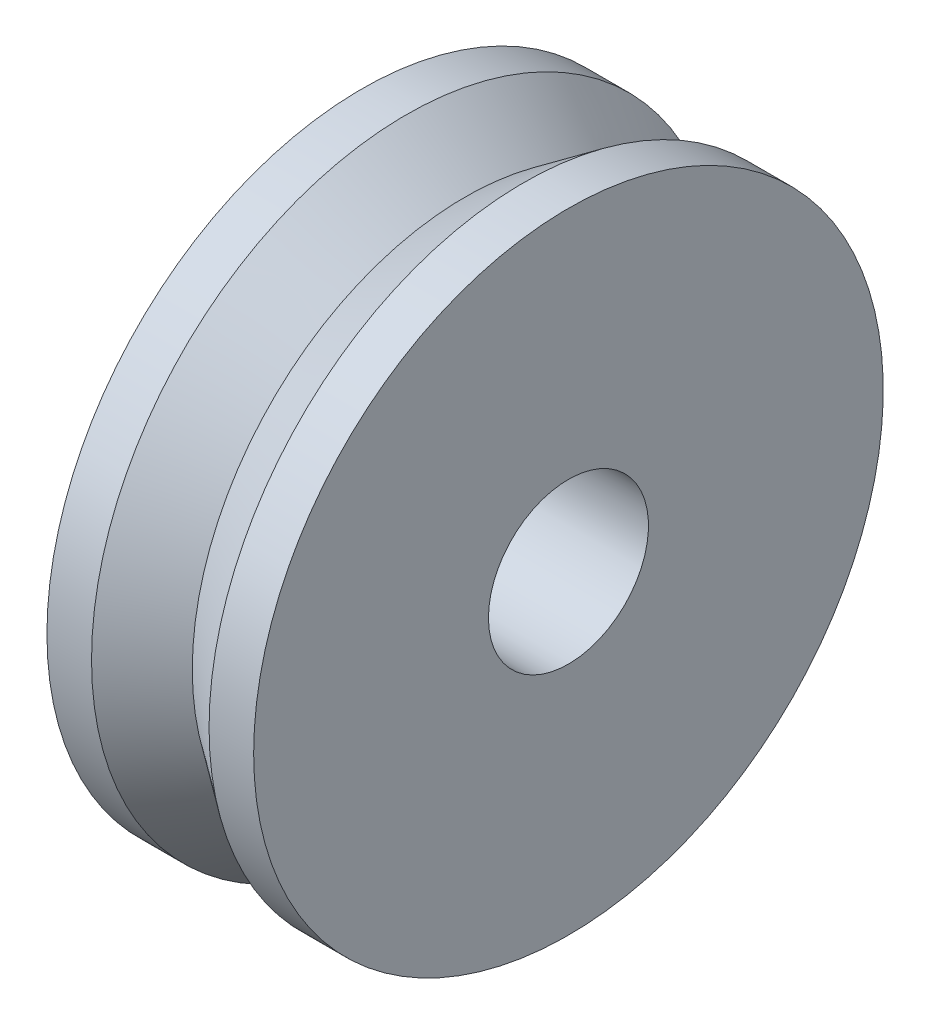
ISO-10303-21;
HEADER;
FILE_DESCRIPTION(('STEP AP214'),'2;1');
FILE_NAME('part.step','',(''),(''),'','','');
FILE_SCHEMA(('AUTOMOTIVE_DESIGN { 1 0 10303 214 1 1 1 1 }'));
ENDSEC;
DATA;
#1=APPLICATION_CONTEXT('core data for automotive mechanical design processes');
#2=APPLICATION_PROTOCOL_DEFINITION('international standard','automotive_design',2000,#1);
#3=PRODUCT_CONTEXT('',#1,'mechanical');
#4=PRODUCT('Part','Part','',(#3));
#5=PRODUCT_RELATED_PRODUCT_CATEGORY('part','',(#4));
#6=PRODUCT_DEFINITION_FORMATION('','',#4);
#7=PRODUCT_DEFINITION_CONTEXT('part definition',#1,'design');
#8=PRODUCT_DEFINITION('design','',#6,#7);
#9=PRODUCT_DEFINITION_SHAPE('','',#8);
#10=(LENGTH_UNIT() NAMED_UNIT(*) SI_UNIT(.MILLI.,.METRE.));
#11=(NAMED_UNIT(*) PLANE_ANGLE_UNIT() SI_UNIT($,.RADIAN.));
#12=(NAMED_UNIT(*) SI_UNIT($,.STERADIAN.) SOLID_ANGLE_UNIT());
#13=UNCERTAINTY_MEASURE_WITH_UNIT(LENGTH_MEASURE(1.E-05),#10,'distance_accuracy_value','');
#14=(GEOMETRIC_REPRESENTATION_CONTEXT(3) GLOBAL_UNCERTAINTY_ASSIGNED_CONTEXT((#13)) GLOBAL_UNIT_ASSIGNED_CONTEXT((#10,
#11,#12)) REPRESENTATION_CONTEXT('',''));
#15=CARTESIAN_POINT('',(0.,0.,0.));
#16=DIRECTION('',(0.,0.,1.));
#17=DIRECTION('',(1.,0.,0.));
#18=AXIS2_PLACEMENT_3D('',#15,#16,#17);
#19=CARTESIAN_POINT('',(-1.68761800987324,2.86482394366197,0.));
#20=DIRECTION('',(1.,0.,0.));
#21=DIRECTION('',(0.,0.,-1.));
#22=AXIS2_PLACEMENT_3D('',#19,#20,#21);
#23=PLANE('',#22);
#24=CARTESIAN_POINT('',(-1.68761800987324,-3.13517605633803,0.));
#25=DIRECTION('',(-1.,0.,0.));
#26=DIRECTION('',(0.,0.,1.));
#27=AXIS2_PLACEMENT_3D('',#24,#25,#26);
#28=CIRCLE('',#27,1.525);
#29=CARTESIAN_POINT('',(-1.68761800987324,-3.13517605633803,1.525));
#30=VERTEX_POINT('',#29);
#31=EDGE_CURVE('E54',#30,#30,#28,.T.);
#32=ORIENTED_EDGE('',*,*,#31,.F.);
#33=EDGE_LOOP('',(#32));
#34=FACE_BOUND('',#33,.T.);
#35=CARTESIAN_POINT('',(-1.68761800987324,-3.13517605633803,0.));
#36=DIRECTION('',(-1.,0.,0.));
#37=DIRECTION('',(0.,0.,1.));
#38=AXIS2_PLACEMENT_3D('',#35,#36,#37);
#39=CIRCLE('',#38,6.);
#40=CARTESIAN_POINT('',(-1.68761800987324,-3.13517605633803,6.));
#41=VERTEX_POINT('',#40);
#42=EDGE_CURVE('E50',#41,#41,#39,.T.);
#43=ORIENTED_EDGE('',*,*,#42,.T.);
#44=EDGE_LOOP('',(#43));
#45=FACE_BOUND('',#44,.T.);
#46=ADVANCED_FACE('F31',(#34,#45),#23,.F.);
#47=CARTESIAN_POINT('',(2.25238199012676,-3.13517605633803,0.));
#48=DIRECTION('',(-1.,0.,0.));
#49=DIRECTION('',(0.,0.,1.));
#50=AXIS2_PLACEMENT_3D('',#47,#48,#49);
#51=PLANE('',#50);
#52=CARTESIAN_POINT('',(2.25238199012676,-3.13517605633803,0.));
#53=DIRECTION('',(-1.,0.,0.));
#54=DIRECTION('',(0.,0.,1.));
#55=AXIS2_PLACEMENT_3D('',#52,#53,#54);
#56=CIRCLE('',#55,1.525);
#57=CARTESIAN_POINT('',(2.25238199012676,-3.13517605633803,1.525));
#58=VERTEX_POINT('',#57);
#59=EDGE_CURVE('E53',#58,#58,#56,.T.);
#60=ORIENTED_EDGE('',*,*,#59,.T.);
#61=EDGE_LOOP('',(#60));
#62=FACE_BOUND('',#61,.T.);
#63=CARTESIAN_POINT('',(2.25238199012676,-3.13517605633803,0.));
#64=DIRECTION('',(-1.,0.,0.));
#65=DIRECTION('',(0.,0.,1.));
#66=AXIS2_PLACEMENT_3D('',#63,#64,#65);
#67=CIRCLE('',#66,6.);
#68=CARTESIAN_POINT('',(2.25238199012676,-3.13517605633803,6.));
#69=VERTEX_POINT('',#68);
#70=EDGE_CURVE('E10',#69,#69,#67,.T.);
#71=ORIENTED_EDGE('',*,*,#70,.F.);
#72=EDGE_LOOP('',(#71));
#73=FACE_BOUND('',#72,.T.);
#74=ADVANCED_FACE('F60',(#62,#73),#51,.F.);
#75=CARTESIAN_POINT('',(-1.68761800987324,-3.13517605633803,0.));
#76=DIRECTION('',(-1.,0.,0.));
#77=DIRECTION('',(0.,0.,1.));
#78=AXIS2_PLACEMENT_3D('',#75,#76,#77);
#79=CYLINDRICAL_SURFACE('',#78,6.);
#80=CARTESIAN_POINT('',(1.40238199012676,-3.13517605633803,0.));
#81=DIRECTION('',(-1.,0.,0.));
#82=DIRECTION('',(0.,0.,1.));
#83=AXIS2_PLACEMENT_3D('',#80,#81,#82);
#84=CIRCLE('',#83,6.);
#85=CARTESIAN_POINT('',(1.40238199012676,-3.13517605633803,6.));
#86=VERTEX_POINT('',#85);
#87=EDGE_CURVE('E37',#86,#86,#84,.T.);
#88=ORIENTED_EDGE('',*,*,#87,.F.);
#89=EDGE_LOOP('',(#88));
#90=FACE_BOUND('',#89,.T.);
#91=ORIENTED_EDGE('',*,*,#70,.T.);
#92=EDGE_LOOP('',(#91));
#93=FACE_BOUND('',#92,.T.);
#94=ADVANCED_FACE('F87',(#90,#93),#79,.T.);
#95=CARTESIAN_POINT('',(1.40238199012676,-3.13517605633803,0.));
#96=DIRECTION('',(1.,0.,0.));
#97=DIRECTION('',(0.,0.,-1.));
#98=AXIS2_PLACEMENT_3D('',#95,#96,#97);
#99=CONICAL_SURFACE('',#98,6.,0.620249485982822);
#100=CARTESIAN_POINT('',(0.282381990126762,-3.13517605633803,0.));
#101=DIRECTION('',(-1.,0.,0.));
#102=DIRECTION('',(0.,0.,1.));
#103=AXIS2_PLACEMENT_3D('',#100,#101,#102);
#104=CIRCLE('',#103,5.2);
#105=CARTESIAN_POINT('',(0.282381990126762,-3.13517605633803,5.2));
#106=VERTEX_POINT('',#105);
#107=EDGE_CURVE('E41',#106,#106,#104,.T.);
#108=ORIENTED_EDGE('',*,*,#107,.F.);
#109=EDGE_LOOP('',(#108));
#110=FACE_BOUND('',#109,.T.);
#111=ORIENTED_EDGE('',*,*,#87,.T.);
#112=EDGE_LOOP('',(#111));
#113=FACE_BOUND('',#112,.T.);
#114=ADVANCED_FACE('F82',(#110,#113),#99,.T.);
#115=CARTESIAN_POINT('',(0.282381990126762,-3.13517605633803,0.));
#116=DIRECTION('',(-1.,0.,0.));
#117=DIRECTION('',(0.,0.,1.));
#118=AXIS2_PLACEMENT_3D('',#115,#116,#117);
#119=CONICAL_SURFACE('',#118,5.2,0.620249485982822);
#120=CARTESIAN_POINT('',(-0.837618009873239,-3.13517605633803,0.));
#121=DIRECTION('',(-1.,0.,0.));
#122=DIRECTION('',(0.,0.,1.));
#123=AXIS2_PLACEMENT_3D('',#120,#121,#122);
#124=CIRCLE('',#123,6.);
#125=CARTESIAN_POINT('',(-0.837618009873239,-3.13517605633803,6.));
#126=VERTEX_POINT('',#125);
#127=EDGE_CURVE('E45',#126,#126,#124,.T.);
#128=ORIENTED_EDGE('',*,*,#127,.F.);
#129=EDGE_LOOP('',(#128));
#130=FACE_BOUND('',#129,.T.);
#131=ORIENTED_EDGE('',*,*,#107,.T.);
#132=EDGE_LOOP('',(#131));
#133=FACE_BOUND('',#132,.T.);
#134=ADVANCED_FACE('F76',(#130,#133),#119,.T.);
#135=CARTESIAN_POINT('',(-1.68761800987324,-3.13517605633803,0.));
#136=DIRECTION('',(-1.,0.,0.));
#137=DIRECTION('',(0.,0.,1.));
#138=AXIS2_PLACEMENT_3D('',#135,#136,#137);
#139=CYLINDRICAL_SURFACE('',#138,6.);
#140=ORIENTED_EDGE('',*,*,#42,.F.);
#141=EDGE_LOOP('',(#140));
#142=FACE_BOUND('',#141,.T.);
#143=ORIENTED_EDGE('',*,*,#127,.T.);
#144=EDGE_LOOP('',(#143));
#145=FACE_BOUND('',#144,.T.);
#146=ADVANCED_FACE('F66',(#142,#145),#139,.T.);
#147=CARTESIAN_POINT('',(2.25238199012676,-3.13517605633803,0.));
#148=DIRECTION('',(-1.,0.,0.));
#149=DIRECTION('',(0.,0.,1.));
#150=AXIS2_PLACEMENT_3D('',#147,#148,#149);
#151=CYLINDRICAL_SURFACE('',#150,1.525);
#152=ORIENTED_EDGE('',*,*,#59,.F.);
#153=EDGE_LOOP('',(#152));
#154=FACE_BOUND('',#153,.T.);
#155=ORIENTED_EDGE('',*,*,#31,.T.);
#156=EDGE_LOOP('',(#155));
#157=FACE_BOUND('',#156,.T.);
#158=ADVANCED_FACE('F63',(#154,#157),#151,.F.);
#159=CLOSED_SHELL('',(#46,#74,#94,#114,#134,#146,#158));
#160=MANIFOLD_SOLID_BREP('B2',#159);
#161=ADVANCED_BREP_SHAPE_REPRESENTATION('',(#18,#160),#14);
#162=SHAPE_DEFINITION_REPRESENTATION(#9,#161);
ENDSEC;
END-ISO-10303-21;
